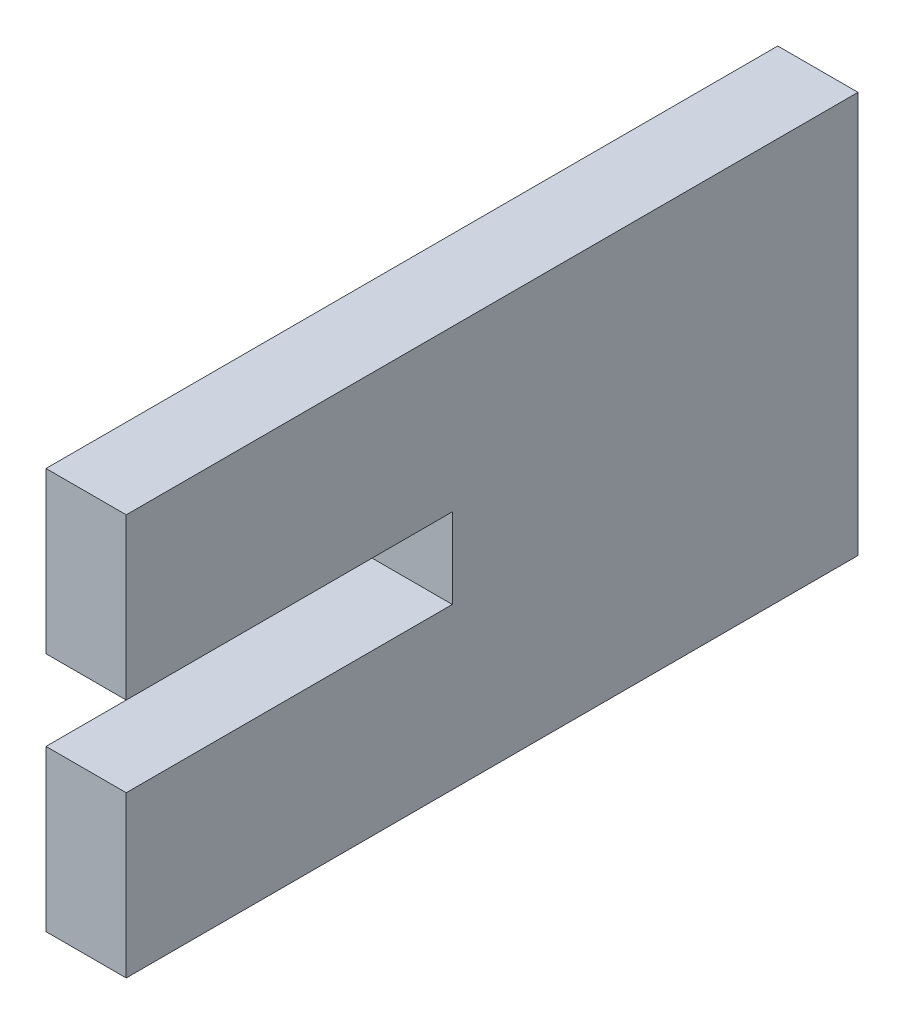
ISO-10303-21;
HEADER;
FILE_DESCRIPTION(('STEP AP214'),'2;1');
FILE_NAME('part.step','',(''),(''),'','','');
FILE_SCHEMA(('AUTOMOTIVE_DESIGN { 1 0 10303 214 1 1 1 1 }'));
ENDSEC;
DATA;
#1=APPLICATION_CONTEXT('core data for automotive mechanical design processes');
#2=APPLICATION_PROTOCOL_DEFINITION('international standard','automotive_design',2000,#1);
#3=PRODUCT_CONTEXT('',#1,'mechanical');
#4=PRODUCT('Part','Part','',(#3));
#5=PRODUCT_RELATED_PRODUCT_CATEGORY('part','',(#4));
#6=PRODUCT_DEFINITION_FORMATION('','',#4);
#7=PRODUCT_DEFINITION_CONTEXT('part definition',#1,'design');
#8=PRODUCT_DEFINITION('design','',#6,#7);
#9=PRODUCT_DEFINITION_SHAPE('','',#8);
#10=(LENGTH_UNIT() NAMED_UNIT(*) SI_UNIT(.MILLI.,.METRE.));
#11=(NAMED_UNIT(*) PLANE_ANGLE_UNIT() SI_UNIT($,.RADIAN.));
#12=(NAMED_UNIT(*) SI_UNIT($,.STERADIAN.) SOLID_ANGLE_UNIT());
#13=UNCERTAINTY_MEASURE_WITH_UNIT(LENGTH_MEASURE(1.E-05),#10,'distance_accuracy_value','');
#14=(GEOMETRIC_REPRESENTATION_CONTEXT(3) GLOBAL_UNCERTAINTY_ASSIGNED_CONTEXT((#13)) GLOBAL_UNIT_ASSIGNED_CONTEXT((#10,
#11,#12)) REPRESENTATION_CONTEXT('',''));
#15=CARTESIAN_POINT('',(0.,0.,0.));
#16=DIRECTION('',(0.,0.,1.));
#17=DIRECTION('',(1.,0.,0.));
#18=AXIS2_PLACEMENT_3D('',#15,#16,#17);
#19=CARTESIAN_POINT('',(4.,20.,13.8064516129032));
#20=DIRECTION('',(0.,-1.,0.));
#21=DIRECTION('',(0.,0.,-1.));
#22=AXIS2_PLACEMENT_3D('',#19,#20,#21);
#23=PLANE('',#22);
#24=DIRECTION('',(0.,0.,1.));
#25=VECTOR('',#24,1.);
#26=CARTESIAN_POINT('',(-4.,20.,13.8064516129032));
#27=LINE('',#26,#25);
#28=CARTESIAN_POINT('',(-4.,20.,-59.1620136706864));
#29=VERTEX_POINT('',#28);
#30=CARTESIAN_POINT('',(-4.,20.,13.8064516129032));
#31=VERTEX_POINT('',#30);
#32=EDGE_CURVE('E148',#29,#31,#27,.T.);
#33=ORIENTED_EDGE('',*,*,#32,.T.);
#34=DIRECTION('',(-1.,0.,0.));
#35=VECTOR('',#34,1.);
#36=CARTESIAN_POINT('',(4.,20.,13.8064516129032));
#37=LINE('',#36,#35);
#38=CARTESIAN_POINT('',(4.,20.,13.8064516129032));
#39=VERTEX_POINT('',#38);
#40=EDGE_CURVE('E11',#39,#31,#37,.T.);
#41=ORIENTED_EDGE('',*,*,#40,.F.);
#42=DIRECTION('',(0.,0.,1.));
#43=VECTOR('',#42,1.);
#44=CARTESIAN_POINT('',(4.,20.,13.8064516129032));
#45=LINE('',#44,#43);
#46=CARTESIAN_POINT('',(4.,20.,-59.1620136706864));
#47=VERTEX_POINT('',#46);
#48=EDGE_CURVE('E170',#47,#39,#45,.T.);
#49=ORIENTED_EDGE('',*,*,#48,.F.);
#50=DIRECTION('',(-1.,0.,0.));
#51=VECTOR('',#50,1.);
#52=CARTESIAN_POINT('',(4.,20.,-59.1620136706864));
#53=LINE('',#52,#51);
#54=EDGE_CURVE('E144',#47,#29,#53,.T.);
#55=ORIENTED_EDGE('',*,*,#54,.T.);
#56=EDGE_LOOP('',(#33,#41,#49,#55));
#57=FACE_BOUND('',#56,.T.);
#58=ADVANCED_FACE('F47',(#57),#23,.F.);
#59=CARTESIAN_POINT('',(4.,3.99999999999999,13.8064516129032));
#60=DIRECTION('',(0.,0.,-1.));
#61=DIRECTION('',(-1.,0.,0.));
#62=AXIS2_PLACEMENT_3D('',#59,#60,#61);
#63=PLANE('',#62);
#64=DIRECTION('',(0.,-1.,0.));
#65=VECTOR('',#64,1.);
#66=CARTESIAN_POINT('',(-4.,3.99999999999999,13.8064516129032));
#67=LINE('',#66,#65);
#68=CARTESIAN_POINT('',(-4.,3.99999999999999,13.8064516129032));
#69=VERTEX_POINT('',#68);
#70=EDGE_CURVE('E152',#31,#69,#67,.T.);
#71=ORIENTED_EDGE('',*,*,#70,.T.);
#72=DIRECTION('',(-1.,0.,0.));
#73=VECTOR('',#72,1.);
#74=CARTESIAN_POINT('',(4.,3.99999999999999,13.8064516129032));
#75=LINE('',#74,#73);
#76=CARTESIAN_POINT('',(4.,3.99999999999999,13.8064516129032));
#77=VERTEX_POINT('',#76);
#78=EDGE_CURVE('E56',#77,#69,#75,.T.);
#79=ORIENTED_EDGE('',*,*,#78,.F.);
#80=DIRECTION('',(0.,-1.,0.));
#81=VECTOR('',#80,1.);
#82=CARTESIAN_POINT('',(4.,3.99999999999999,13.8064516129032));
#83=LINE('',#82,#81);
#84=EDGE_CURVE('E107',#39,#77,#83,.T.);
#85=ORIENTED_EDGE('',*,*,#84,.F.);
#86=ORIENTED_EDGE('',*,*,#40,.T.);
#87=EDGE_LOOP('',(#71,#79,#85,#86));
#88=FACE_BOUND('',#87,.T.);
#89=ADVANCED_FACE('F216',(#88),#63,.F.);
#90=CARTESIAN_POINT('',(4.,4.,-18.7096774193548));
#91=DIRECTION('',(0.,1.,0.));
#92=DIRECTION('',(0.,0.,1.));
#93=AXIS2_PLACEMENT_3D('',#90,#91,#92);
#94=PLANE('',#93);
#95=DIRECTION('',(0.,0.,-1.));
#96=VECTOR('',#95,1.);
#97=CARTESIAN_POINT('',(-4.,4.,-18.7096774193548));
#98=LINE('',#97,#96);
#99=CARTESIAN_POINT('',(-4.,4.,-18.7096774193548));
#100=VERTEX_POINT('',#99);
#101=EDGE_CURVE('E155',#69,#100,#98,.T.);
#102=ORIENTED_EDGE('',*,*,#101,.T.);
#103=DIRECTION('',(-1.,0.,0.));
#104=VECTOR('',#103,1.);
#105=CARTESIAN_POINT('',(4.,4.,-18.7096774193548));
#106=LINE('',#105,#104);
#107=CARTESIAN_POINT('',(4.,4.,-18.7096774193548));
#108=VERTEX_POINT('',#107);
#109=EDGE_CURVE('E181',#108,#100,#106,.T.);
#110=ORIENTED_EDGE('',*,*,#109,.F.);
#111=DIRECTION('',(0.,0.,-1.));
#112=VECTOR('',#111,1.);
#113=CARTESIAN_POINT('',(4.,4.,-18.7096774193548));
#114=LINE('',#113,#112);
#115=EDGE_CURVE('E191',#77,#108,#114,.T.);
#116=ORIENTED_EDGE('',*,*,#115,.F.);
#117=ORIENTED_EDGE('',*,*,#78,.T.);
#118=EDGE_LOOP('',(#102,#110,#116,#117));
#119=FACE_BOUND('',#118,.T.);
#120=ADVANCED_FACE('F189',(#119),#94,.F.);
#121=CARTESIAN_POINT('',(4.,-4.,-18.7096774193548));
#122=DIRECTION('',(0.,0.,-1.));
#123=DIRECTION('',(-1.,0.,0.));
#124=AXIS2_PLACEMENT_3D('',#121,#122,#123);
#125=PLANE('',#124);
#126=DIRECTION('',(0.,-1.,0.));
#127=VECTOR('',#126,1.);
#128=CARTESIAN_POINT('',(-4.,-4.,-18.7096774193548));
#129=LINE('',#128,#127);
#130=CARTESIAN_POINT('',(-4.,-4.,-18.7096774193548));
#131=VERTEX_POINT('',#130);
#132=EDGE_CURVE('E158',#100,#131,#129,.T.);
#133=ORIENTED_EDGE('',*,*,#132,.T.);
#134=DIRECTION('',(-1.,0.,0.));
#135=VECTOR('',#134,1.);
#136=CARTESIAN_POINT('',(4.,-4.,-18.7096774193548));
#137=LINE('',#136,#135);
#138=CARTESIAN_POINT('',(4.,-4.,-18.7096774193548));
#139=VERTEX_POINT('',#138);
#140=EDGE_CURVE('E177',#139,#131,#137,.T.);
#141=ORIENTED_EDGE('',*,*,#140,.F.);
#142=DIRECTION('',(0.,-1.,0.));
#143=VECTOR('',#142,1.);
#144=CARTESIAN_POINT('',(4.,-4.,-18.7096774193548));
#145=LINE('',#144,#143);
#146=EDGE_CURVE('E204',#108,#139,#145,.T.);
#147=ORIENTED_EDGE('',*,*,#146,.F.);
#148=ORIENTED_EDGE('',*,*,#109,.T.);
#149=EDGE_LOOP('',(#133,#141,#147,#148));
#150=FACE_BOUND('',#149,.T.);
#151=ADVANCED_FACE('F199',(#150),#125,.F.);
#152=CARTESIAN_POINT('',(4.,-4.,13.8064516129032));
#153=DIRECTION('',(0.,-1.,0.));
#154=DIRECTION('',(0.,0.,-1.));
#155=AXIS2_PLACEMENT_3D('',#152,#153,#154);
#156=PLANE('',#155);
#157=DIRECTION('',(0.,0.,1.));
#158=VECTOR('',#157,1.);
#159=CARTESIAN_POINT('',(-4.,-4.,13.8064516129032));
#160=LINE('',#159,#158);
#161=CARTESIAN_POINT('',(-4.,-4.,13.8064516129032));
#162=VERTEX_POINT('',#161);
#163=EDGE_CURVE('E161',#131,#162,#160,.T.);
#164=ORIENTED_EDGE('',*,*,#163,.T.);
#165=DIRECTION('',(-1.,0.,0.));
#166=VECTOR('',#165,1.);
#167=CARTESIAN_POINT('',(4.,-4.,13.8064516129032));
#168=LINE('',#167,#166);
#169=CARTESIAN_POINT('',(4.,-4.,13.8064516129032));
#170=VERTEX_POINT('',#169);
#171=EDGE_CURVE('E137',#170,#162,#168,.T.);
#172=ORIENTED_EDGE('',*,*,#171,.F.);
#173=DIRECTION('',(0.,0.,1.));
#174=VECTOR('',#173,1.);
#175=CARTESIAN_POINT('',(4.,-4.,13.8064516129032));
#176=LINE('',#175,#174);
#177=EDGE_CURVE('E126',#139,#170,#176,.T.);
#178=ORIENTED_EDGE('',*,*,#177,.F.);
#179=ORIENTED_EDGE('',*,*,#140,.T.);
#180=EDGE_LOOP('',(#164,#172,#178,#179));
#181=FACE_BOUND('',#180,.T.);
#182=ADVANCED_FACE('F202',(#181),#156,.F.);
#183=CARTESIAN_POINT('',(4.,-20.,13.8064516129032));
#184=DIRECTION('',(0.,0.,-1.));
#185=DIRECTION('',(-1.,0.,0.));
#186=AXIS2_PLACEMENT_3D('',#183,#184,#185);
#187=PLANE('',#186);
#188=DIRECTION('',(0.,-1.,0.));
#189=VECTOR('',#188,1.);
#190=CARTESIAN_POINT('',(-4.,-20.,13.8064516129032));
#191=LINE('',#190,#189);
#192=CARTESIAN_POINT('',(-4.,-20.,13.8064516129032));
#193=VERTEX_POINT('',#192);
#194=EDGE_CURVE('E135',#162,#193,#191,.T.);
#195=ORIENTED_EDGE('',*,*,#194,.T.);
#196=DIRECTION('',(-1.,0.,0.));
#197=VECTOR('',#196,1.);
#198=CARTESIAN_POINT('',(4.,-20.,13.8064516129032));
#199=LINE('',#198,#197);
#200=CARTESIAN_POINT('',(4.,-20.,13.8064516129032));
#201=VERTEX_POINT('',#200);
#202=EDGE_CURVE('E132',#201,#193,#199,.T.);
#203=ORIENTED_EDGE('',*,*,#202,.F.);
#204=DIRECTION('',(0.,-1.,0.));
#205=VECTOR('',#204,1.);
#206=CARTESIAN_POINT('',(4.,-20.,13.8064516129032));
#207=LINE('',#206,#205);
#208=EDGE_CURVE('E120',#170,#201,#207,.T.);
#209=ORIENTED_EDGE('',*,*,#208,.F.);
#210=ORIENTED_EDGE('',*,*,#171,.T.);
#211=EDGE_LOOP('',(#195,#203,#209,#210));
#212=FACE_BOUND('',#211,.T.);
#213=ADVANCED_FACE('F133',(#212),#187,.F.);
#214=CARTESIAN_POINT('',(4.,-20.,-59.1620136706864));
#215=DIRECTION('',(0.,1.,0.));
#216=DIRECTION('',(0.,0.,1.));
#217=AXIS2_PLACEMENT_3D('',#214,#215,#216);
#218=PLANE('',#217);
#219=DIRECTION('',(0.,0.,-1.));
#220=VECTOR('',#219,1.);
#221=CARTESIAN_POINT('',(-4.,-20.,-59.1620136706864));
#222=LINE('',#221,#220);
#223=CARTESIAN_POINT('',(-4.,-20.,-59.1620136706864));
#224=VERTEX_POINT('',#223);
#225=EDGE_CURVE('E93',#193,#224,#222,.T.);
#226=ORIENTED_EDGE('',*,*,#225,.T.);
#227=DIRECTION('',(-1.,0.,0.));
#228=VECTOR('',#227,1.);
#229=CARTESIAN_POINT('',(4.,-20.,-59.1620136706864));
#230=LINE('',#229,#228);
#231=CARTESIAN_POINT('',(4.,-20.,-59.1620136706864));
#232=VERTEX_POINT('',#231);
#233=EDGE_CURVE('E138',#232,#224,#230,.T.);
#234=ORIENTED_EDGE('',*,*,#233,.F.);
#235=DIRECTION('',(0.,0.,-1.));
#236=VECTOR('',#235,1.);
#237=CARTESIAN_POINT('',(4.,-20.,-59.1620136706864));
#238=LINE('',#237,#236);
#239=EDGE_CURVE('E124',#201,#232,#238,.T.);
#240=ORIENTED_EDGE('',*,*,#239,.F.);
#241=ORIENTED_EDGE('',*,*,#202,.T.);
#242=EDGE_LOOP('',(#226,#234,#240,#241));
#243=FACE_BOUND('',#242,.T.);
#244=ADVANCED_FACE('F140',(#243),#218,.F.);
#245=CARTESIAN_POINT('',(4.,20.,-59.1620136706864));
#246=DIRECTION('',(0.,0.,1.));
#247=DIRECTION('',(0.,-1.,0.));
#248=AXIS2_PLACEMENT_3D('',#245,#246,#247);
#249=PLANE('',#248);
#250=DIRECTION('',(0.,1.,0.));
#251=VECTOR('',#250,1.);
#252=CARTESIAN_POINT('',(-4.,20.,-59.1620136706864));
#253=LINE('',#252,#251);
#254=EDGE_CURVE('E99',#224,#29,#253,.T.);
#255=ORIENTED_EDGE('',*,*,#254,.T.);
#256=ORIENTED_EDGE('',*,*,#54,.F.);
#257=DIRECTION('',(0.,1.,0.));
#258=VECTOR('',#257,1.);
#259=CARTESIAN_POINT('',(4.,20.,-59.1620136706864));
#260=LINE('',#259,#258);
#261=EDGE_CURVE('E64',#232,#47,#260,.T.);
#262=ORIENTED_EDGE('',*,*,#261,.F.);
#263=ORIENTED_EDGE('',*,*,#233,.T.);
#264=EDGE_LOOP('',(#255,#256,#262,#263));
#265=FACE_BOUND('',#264,.T.);
#266=ADVANCED_FACE('F232',(#265),#249,.F.);
#267=CARTESIAN_POINT('',(4.,0.,0.));
#268=DIRECTION('',(-1.,0.,0.));
#269=DIRECTION('',(0.,0.,1.));
#270=AXIS2_PLACEMENT_3D('',#267,#268,#269);
#271=PLANE('',#270);
#272=ORIENTED_EDGE('',*,*,#48,.T.);
#273=ORIENTED_EDGE('',*,*,#84,.T.);
#274=ORIENTED_EDGE('',*,*,#115,.T.);
#275=ORIENTED_EDGE('',*,*,#146,.T.);
#276=ORIENTED_EDGE('',*,*,#177,.T.);
#277=ORIENTED_EDGE('',*,*,#208,.T.);
#278=ORIENTED_EDGE('',*,*,#239,.T.);
#279=ORIENTED_EDGE('',*,*,#261,.T.);
#280=EDGE_LOOP('',(#272,#273,#274,#275,#276,#277,#278,#279));
#281=FACE_BOUND('',#280,.T.);
#282=ADVANCED_FACE('F122',(#281),#271,.F.);
#283=CARTESIAN_POINT('',(-4.,0.,0.));
#284=DIRECTION('',(-1.,0.,0.));
#285=DIRECTION('',(0.,0.,1.));
#286=AXIS2_PLACEMENT_3D('',#283,#284,#285);
#287=PLANE('',#286);
#288=ORIENTED_EDGE('',*,*,#32,.F.);
#289=ORIENTED_EDGE('',*,*,#254,.F.);
#290=ORIENTED_EDGE('',*,*,#225,.F.);
#291=ORIENTED_EDGE('',*,*,#194,.F.);
#292=ORIENTED_EDGE('',*,*,#163,.F.);
#293=ORIENTED_EDGE('',*,*,#132,.F.);
#294=ORIENTED_EDGE('',*,*,#101,.F.);
#295=ORIENTED_EDGE('',*,*,#70,.F.);
#296=EDGE_LOOP('',(#288,#289,#290,#291,#292,#293,#294,#295));
#297=FACE_BOUND('',#296,.T.);
#298=ADVANCED_FACE('F195',(#297),#287,.T.);
#299=CLOSED_SHELL('',(#58,#89,#120,#151,#182,#213,#244,#266,#282,#298));
#300=MANIFOLD_SOLID_BREP('B2',#299);
#301=ADVANCED_BREP_SHAPE_REPRESENTATION('',(#18,#300),#14);
#302=SHAPE_DEFINITION_REPRESENTATION(#9,#301);
ENDSEC;
END-ISO-10303-21;
